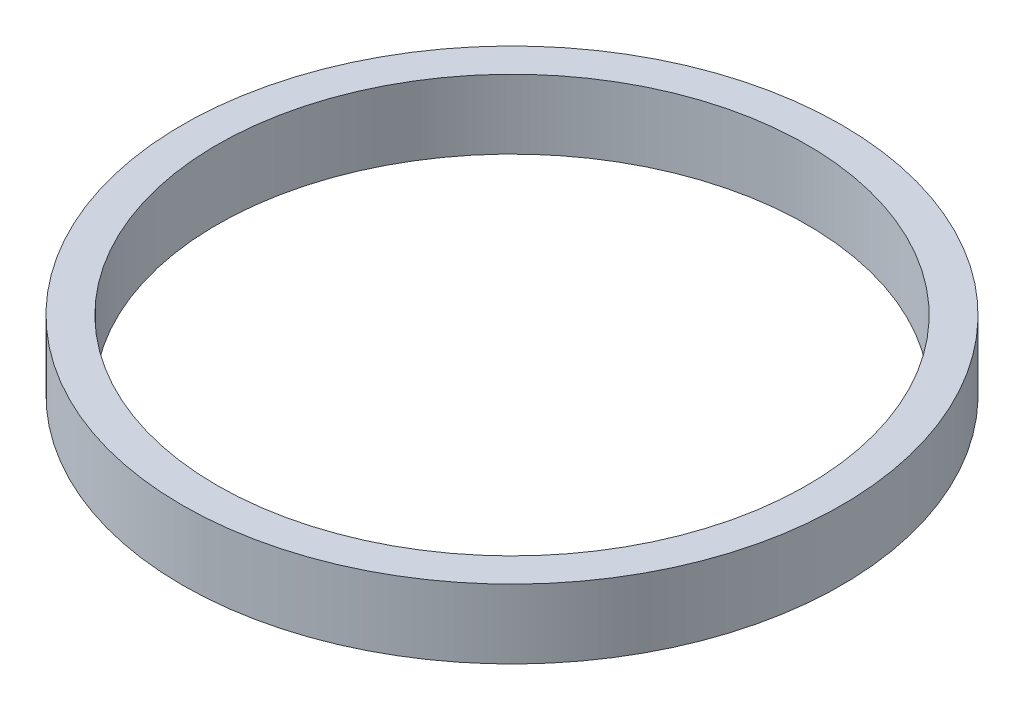
ISO-10303-21;
HEADER;
FILE_DESCRIPTION(('STEP AP214'),'2;1');
FILE_NAME('part.step','',(''),(''),'','','');
FILE_SCHEMA(('AUTOMOTIVE_DESIGN { 1 0 10303 214 1 1 1 1 }'));
ENDSEC;
DATA;
#1=APPLICATION_CONTEXT('core data for automotive mechanical design processes');
#2=APPLICATION_PROTOCOL_DEFINITION('international standard','automotive_design',2000,#1);
#3=PRODUCT_CONTEXT('',#1,'mechanical');
#4=PRODUCT('Part','Part','',(#3));
#5=PRODUCT_RELATED_PRODUCT_CATEGORY('part','',(#4));
#6=PRODUCT_DEFINITION_FORMATION('','',#4);
#7=PRODUCT_DEFINITION_CONTEXT('part definition',#1,'design');
#8=PRODUCT_DEFINITION('design','',#6,#7);
#9=PRODUCT_DEFINITION_SHAPE('','',#8);
#10=(LENGTH_UNIT() NAMED_UNIT(*) SI_UNIT(.MILLI.,.METRE.));
#11=(NAMED_UNIT(*) PLANE_ANGLE_UNIT() SI_UNIT($,.RADIAN.));
#12=(NAMED_UNIT(*) SI_UNIT($,.STERADIAN.) SOLID_ANGLE_UNIT());
#13=UNCERTAINTY_MEASURE_WITH_UNIT(LENGTH_MEASURE(1.E-05),#10,'distance_accuracy_value','');
#14=(GEOMETRIC_REPRESENTATION_CONTEXT(3) GLOBAL_UNCERTAINTY_ASSIGNED_CONTEXT((#13)) GLOBAL_UNIT_ASSIGNED_CONTEXT((#10,
#11,#12)) REPRESENTATION_CONTEXT('',''));
#15=CARTESIAN_POINT('',(0.,0.,0.));
#16=DIRECTION('',(0.,0.,1.));
#17=DIRECTION('',(1.,0.,0.));
#18=AXIS2_PLACEMENT_3D('',#15,#16,#17);
#19=CARTESIAN_POINT('',(0.,10.,0.));
#20=DIRECTION('',(0.,1.,0.));
#21=DIRECTION('',(0.,0.,1.));
#22=AXIS2_PLACEMENT_3D('',#19,#20,#21);
#23=PLANE('',#22);
#24=CARTESIAN_POINT('',(0.,10.,0.));
#25=DIRECTION('',(0.,1.,0.));
#26=DIRECTION('',(0.,0.,1.));
#27=AXIS2_PLACEMENT_3D('',#24,#25,#26);
#28=CIRCLE('',#27,47.65);
#29=CARTESIAN_POINT('',(0.,10.,47.65));
#30=VERTEX_POINT('',#29);
#31=EDGE_CURVE('E10',#30,#30,#28,.T.);
#32=ORIENTED_EDGE('',*,*,#31,.T.);
#33=EDGE_LOOP('',(#32));
#34=FACE_BOUND('',#33,.T.);
#35=CARTESIAN_POINT('',(0.,10.,0.));
#36=DIRECTION('',(0.,1.,0.));
#37=DIRECTION('',(0.,0.,1.));
#38=AXIS2_PLACEMENT_3D('',#35,#36,#37);
#39=CIRCLE('',#38,42.65);
#40=CARTESIAN_POINT('',(0.,10.,42.65));
#41=VERTEX_POINT('',#40);
#42=EDGE_CURVE('E54',#41,#41,#39,.T.);
#43=ORIENTED_EDGE('',*,*,#42,.F.);
#44=EDGE_LOOP('',(#43));
#45=FACE_BOUND('',#44,.T.);
#46=ADVANCED_FACE('F41',(#34,#45),#23,.T.);
#47=CARTESIAN_POINT('',(0.,0.,0.));
#48=DIRECTION('',(0.,1.,0.));
#49=DIRECTION('',(0.,0.,1.));
#50=AXIS2_PLACEMENT_3D('',#47,#48,#49);
#51=PLANE('',#50);
#52=CARTESIAN_POINT('',(0.,0.,0.));
#53=DIRECTION('',(0.,1.,0.));
#54=DIRECTION('',(0.,0.,1.));
#55=AXIS2_PLACEMENT_3D('',#52,#53,#54);
#56=CIRCLE('',#55,47.65);
#57=CARTESIAN_POINT('',(0.,0.,47.65));
#58=VERTEX_POINT('',#57);
#59=EDGE_CURVE('E45',#58,#58,#56,.T.);
#60=ORIENTED_EDGE('',*,*,#59,.F.);
#61=EDGE_LOOP('',(#60));
#62=FACE_BOUND('',#61,.T.);
#63=CARTESIAN_POINT('',(0.,0.,0.));
#64=DIRECTION('',(0.,1.,0.));
#65=DIRECTION('',(0.,0.,1.));
#66=AXIS2_PLACEMENT_3D('',#63,#64,#65);
#67=CIRCLE('',#66,42.65);
#68=CARTESIAN_POINT('',(0.,0.,42.65));
#69=VERTEX_POINT('',#68);
#70=EDGE_CURVE('E56',#69,#69,#67,.T.);
#71=ORIENTED_EDGE('',*,*,#70,.T.);
#72=EDGE_LOOP('',(#71));
#73=FACE_BOUND('',#72,.T.);
#74=ADVANCED_FACE('F68',(#62,#73),#51,.F.);
#75=CARTESIAN_POINT('',(0.,10.,0.));
#76=DIRECTION('',(0.,-1.,0.));
#77=DIRECTION('',(0.,0.,-1.));
#78=AXIS2_PLACEMENT_3D('',#75,#76,#77);
#79=CYLINDRICAL_SURFACE('',#78,47.65);
#80=ORIENTED_EDGE('',*,*,#31,.F.);
#81=EDGE_LOOP('',(#80));
#82=FACE_BOUND('',#81,.T.);
#83=ORIENTED_EDGE('',*,*,#59,.T.);
#84=EDGE_LOOP('',(#83));
#85=FACE_BOUND('',#84,.T.);
#86=ADVANCED_FACE('F43',(#82,#85),#79,.T.);
#87=CARTESIAN_POINT('',(0.,10.,0.));
#88=DIRECTION('',(0.,-1.,0.));
#89=DIRECTION('',(0.,0.,-1.));
#90=AXIS2_PLACEMENT_3D('',#87,#88,#89);
#91=CYLINDRICAL_SURFACE('',#90,42.65);
#92=ORIENTED_EDGE('',*,*,#42,.T.);
#93=EDGE_LOOP('',(#92));
#94=FACE_BOUND('',#93,.T.);
#95=ORIENTED_EDGE('',*,*,#70,.F.);
#96=EDGE_LOOP('',(#95));
#97=FACE_BOUND('',#96,.T.);
#98=ADVANCED_FACE('F64',(#94,#97),#91,.F.);
#99=CLOSED_SHELL('',(#46,#74,#86,#98));
#100=MANIFOLD_SOLID_BREP('B2',#99);
#101=ADVANCED_BREP_SHAPE_REPRESENTATION('',(#18,#100),#14);
#102=SHAPE_DEFINITION_REPRESENTATION(#9,#101);
ENDSEC;
END-ISO-10303-21;
